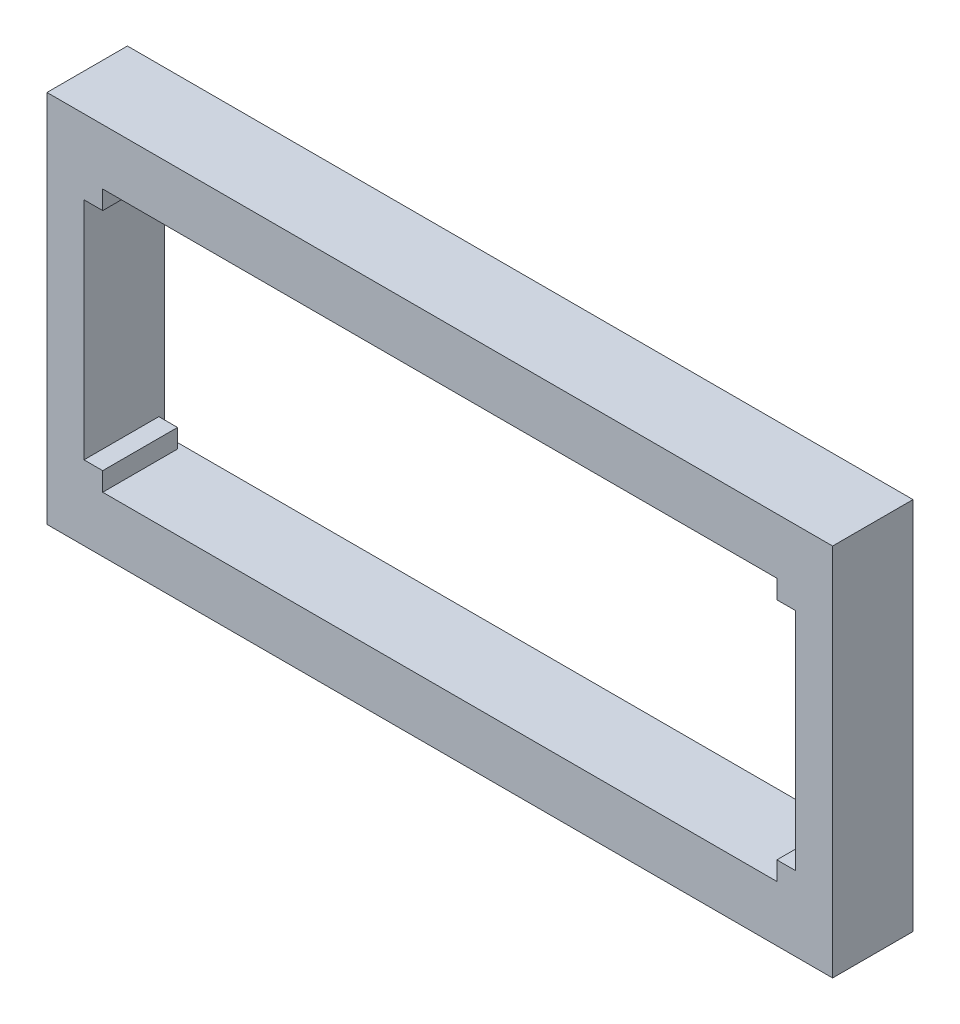
ISO-10303-21;
HEADER;
FILE_DESCRIPTION(('STEP AP214'),'2;1');
FILE_NAME('part.step','',(''),(''),'','','');
FILE_SCHEMA(('AUTOMOTIVE_DESIGN { 1 0 10303 214 1 1 1 1 }'));
ENDSEC;
DATA;
#1=APPLICATION_CONTEXT('core data for automotive mechanical design processes');
#2=APPLICATION_PROTOCOL_DEFINITION('international standard','automotive_design',2000,#1);
#3=PRODUCT_CONTEXT('',#1,'mechanical');
#4=PRODUCT('Part','Part','',(#3));
#5=PRODUCT_RELATED_PRODUCT_CATEGORY('part','',(#4));
#6=PRODUCT_DEFINITION_FORMATION('','',#4);
#7=PRODUCT_DEFINITION_CONTEXT('part definition',#1,'design');
#8=PRODUCT_DEFINITION('design','',#6,#7);
#9=PRODUCT_DEFINITION_SHAPE('','',#8);
#10=(LENGTH_UNIT() NAMED_UNIT(*) SI_UNIT(.MILLI.,.METRE.));
#11=(NAMED_UNIT(*) PLANE_ANGLE_UNIT() SI_UNIT($,.RADIAN.));
#12=(NAMED_UNIT(*) SI_UNIT($,.STERADIAN.) SOLID_ANGLE_UNIT());
#13=UNCERTAINTY_MEASURE_WITH_UNIT(LENGTH_MEASURE(1.E-05),#10,'distance_accuracy_value','');
#14=(GEOMETRIC_REPRESENTATION_CONTEXT(3) GLOBAL_UNCERTAINTY_ASSIGNED_CONTEXT((#13)) GLOBAL_UNIT_ASSIGNED_CONTEXT((#10,
#11,#12)) REPRESENTATION_CONTEXT('',''));
#15=CARTESIAN_POINT('',(0.,0.,0.));
#16=DIRECTION('',(0.,0.,1.));
#17=DIRECTION('',(1.,0.,0.));
#18=AXIS2_PLACEMENT_3D('',#15,#16,#17);
#19=CARTESIAN_POINT('',(0.,0.,0.));
#20=DIRECTION('',(0.,0.,1.));
#21=DIRECTION('',(1.,0.,0.));
#22=AXIS2_PLACEMENT_3D('',#19,#20,#21);
#23=PLANE('',#22);
#24=DIRECTION('',(0.,-1.,0.));
#25=VECTOR('',#24,1.);
#26=CARTESIAN_POINT('',(-9.90000000000001,85.1,0.));
#27=LINE('',#26,#25);
#28=CARTESIAN_POINT('',(-9.90000000000001,85.1,0.));
#29=VERTEX_POINT('',#28);
#30=CARTESIAN_POINT('',(-9.90000000000001,-14.9,0.));
#31=VERTEX_POINT('',#30);
#32=EDGE_CURVE('E414',#29,#31,#27,.T.);
#33=ORIENTED_EDGE('',*,*,#32,.F.);
#34=DIRECTION('',(-1.,0.,0.));
#35=VECTOR('',#34,1.);
#36=CARTESIAN_POINT('',(-9.90000000000001,85.1,0.));
#37=LINE('',#36,#35);
#38=CARTESIAN_POINT('',(200.1,85.1,0.));
#39=VERTEX_POINT('',#38);
#40=EDGE_CURVE('E281',#39,#29,#37,.T.);
#41=ORIENTED_EDGE('',*,*,#40,.F.);
#42=DIRECTION('',(0.,1.,0.));
#43=VECTOR('',#42,1.);
#44=CARTESIAN_POINT('',(200.1,85.1,0.));
#45=LINE('',#44,#43);
#46=CARTESIAN_POINT('',(200.1,-14.9,0.));
#47=VERTEX_POINT('',#46);
#48=EDGE_CURVE('E416',#47,#39,#45,.T.);
#49=ORIENTED_EDGE('',*,*,#48,.F.);
#50=DIRECTION('',(1.,0.,0.));
#51=VECTOR('',#50,1.);
#52=CARTESIAN_POINT('',(-9.90000000000001,-14.9,0.));
#53=LINE('',#52,#51);
#54=EDGE_CURVE('E420',#31,#47,#53,.T.);
#55=ORIENTED_EDGE('',*,*,#54,.F.);
#56=EDGE_LOOP('',(#33,#41,#49,#55));
#57=FACE_BOUND('',#56,.T.);
#58=DIRECTION('',(0.,-1.,0.));
#59=VECTOR('',#58,1.);
#60=CARTESIAN_POINT('',(0.,0.,0.));
#61=LINE('',#60,#59);
#62=CARTESIAN_POINT('',(0.,70.2,0.));
#63=VERTEX_POINT('',#62);
#64=CARTESIAN_POINT('',(0.,0.,0.));
#65=VERTEX_POINT('',#64);
#66=EDGE_CURVE('E158',#63,#65,#61,.T.);
#67=ORIENTED_EDGE('',*,*,#66,.T.);
#68=DIRECTION('',(1.,0.,0.));
#69=VECTOR('',#68,1.);
#70=CARTESIAN_POINT('',(0.,0.,0.));
#71=LINE('',#70,#69);
#72=CARTESIAN_POINT('',(190.2,0.,0.));
#73=VERTEX_POINT('',#72);
#74=EDGE_CURVE('E399',#65,#73,#71,.T.);
#75=ORIENTED_EDGE('',*,*,#74,.T.);
#76=DIRECTION('',(0.,1.,0.));
#77=VECTOR('',#76,1.);
#78=CARTESIAN_POINT('',(190.2,0.,0.));
#79=LINE('',#78,#77);
#80=CARTESIAN_POINT('',(190.2,70.2,0.));
#81=VERTEX_POINT('',#80);
#82=EDGE_CURVE('E405',#73,#81,#79,.T.);
#83=ORIENTED_EDGE('',*,*,#82,.T.);
#84=DIRECTION('',(-1.,0.,0.));
#85=VECTOR('',#84,1.);
#86=CARTESIAN_POINT('',(0.,70.2,0.));
#87=LINE('',#86,#85);
#88=EDGE_CURVE('E404',#81,#63,#87,.T.);
#89=ORIENTED_EDGE('',*,*,#88,.T.);
#90=EDGE_LOOP('',(#67,#75,#83,#89));
#91=FACE_BOUND('',#90,.T.);
#92=ADVANCED_FACE('F140',(#57,#91),#23,.F.);
#93=CARTESIAN_POINT('',(-9.90000000000001,85.1,1.5));
#94=DIRECTION('',(1.,0.,0.));
#95=DIRECTION('',(0.,0.,-1.));
#96=AXIS2_PLACEMENT_3D('',#93,#94,#95);
#97=PLANE('',#96);
#98=ORIENTED_EDGE('',*,*,#32,.T.);
#99=DIRECTION('',(0.,0.,-1.));
#100=VECTOR('',#99,1.);
#101=CARTESIAN_POINT('',(-9.90000000000001,-14.9,1.5));
#102=LINE('',#101,#100);
#103=CARTESIAN_POINT('',(-9.90000000000001,-14.9,21.5));
#104=VERTEX_POINT('',#103);
#105=EDGE_CURVE('E12',#104,#31,#102,.T.);
#106=ORIENTED_EDGE('',*,*,#105,.F.);
#107=DIRECTION('',(0.,-1.,0.));
#108=VECTOR('',#107,1.);
#109=CARTESIAN_POINT('',(-9.90000000000001,0.,21.5));
#110=LINE('',#109,#108);
#111=CARTESIAN_POINT('',(-9.90000000000001,85.1,21.5));
#112=VERTEX_POINT('',#111);
#113=EDGE_CURVE('E292',#112,#104,#110,.T.);
#114=ORIENTED_EDGE('',*,*,#113,.F.);
#115=DIRECTION('',(0.,0.,-1.));
#116=VECTOR('',#115,1.);
#117=CARTESIAN_POINT('',(-9.90000000000001,85.1,1.5));
#118=LINE('',#117,#116);
#119=EDGE_CURVE('E280',#112,#29,#118,.T.);
#120=ORIENTED_EDGE('',*,*,#119,.T.);
#121=EDGE_LOOP('',(#98,#106,#114,#120));
#122=FACE_BOUND('',#121,.T.);
#123=ADVANCED_FACE('F137',(#122),#97,.F.);
#124=CARTESIAN_POINT('',(-9.90000000000001,-14.9,1.5));
#125=DIRECTION('',(0.,1.,0.));
#126=DIRECTION('',(-1.,0.,0.));
#127=AXIS2_PLACEMENT_3D('',#124,#125,#126);
#128=PLANE('',#127);
#129=ORIENTED_EDGE('',*,*,#54,.T.);
#130=DIRECTION('',(0.,0.,-1.));
#131=VECTOR('',#130,1.);
#132=CARTESIAN_POINT('',(200.1,-14.9,1.5));
#133=LINE('',#132,#131);
#134=CARTESIAN_POINT('',(200.1,-14.9,21.5));
#135=VERTEX_POINT('',#134);
#136=EDGE_CURVE('E144',#135,#47,#133,.T.);
#137=ORIENTED_EDGE('',*,*,#136,.F.);
#138=DIRECTION('',(1.,0.,0.));
#139=VECTOR('',#138,1.);
#140=CARTESIAN_POINT('',(0.,-14.9,21.5));
#141=LINE('',#140,#139);
#142=EDGE_CURVE('E293',#104,#135,#141,.T.);
#143=ORIENTED_EDGE('',*,*,#142,.F.);
#144=ORIENTED_EDGE('',*,*,#105,.T.);
#145=EDGE_LOOP('',(#129,#137,#143,#144));
#146=FACE_BOUND('',#145,.T.);
#147=ADVANCED_FACE('F429',(#146),#128,.F.);
#148=CARTESIAN_POINT('',(200.1,85.1,1.5));
#149=DIRECTION('',(-1.,0.,0.));
#150=DIRECTION('',(0.,0.,1.));
#151=AXIS2_PLACEMENT_3D('',#148,#149,#150);
#152=PLANE('',#151);
#153=ORIENTED_EDGE('',*,*,#48,.T.);
#154=DIRECTION('',(0.,0.,-1.));
#155=VECTOR('',#154,1.);
#156=CARTESIAN_POINT('',(200.1,85.1,1.5));
#157=LINE('',#156,#155);
#158=CARTESIAN_POINT('',(200.1,85.1,21.5));
#159=VERTEX_POINT('',#158);
#160=EDGE_CURVE('E288',#159,#39,#157,.T.);
#161=ORIENTED_EDGE('',*,*,#160,.F.);
#162=DIRECTION('',(0.,1.,0.));
#163=VECTOR('',#162,1.);
#164=CARTESIAN_POINT('',(200.1,0.,21.5));
#165=LINE('',#164,#163);
#166=EDGE_CURVE('E296',#135,#159,#165,.T.);
#167=ORIENTED_EDGE('',*,*,#166,.F.);
#168=ORIENTED_EDGE('',*,*,#136,.T.);
#169=EDGE_LOOP('',(#153,#161,#167,#168));
#170=FACE_BOUND('',#169,.T.);
#171=ADVANCED_FACE('F421',(#170),#152,.F.);
#172=CARTESIAN_POINT('',(-9.90000000000001,85.1,1.5));
#173=DIRECTION('',(0.,-1.,0.));
#174=DIRECTION('',(1.,0.,0.));
#175=AXIS2_PLACEMENT_3D('',#172,#173,#174);
#176=PLANE('',#175);
#177=ORIENTED_EDGE('',*,*,#40,.T.);
#178=ORIENTED_EDGE('',*,*,#119,.F.);
#179=DIRECTION('',(-1.,0.,0.));
#180=VECTOR('',#179,1.);
#181=CARTESIAN_POINT('',(0.,85.1,21.5));
#182=LINE('',#181,#180);
#183=EDGE_CURVE('E285',#159,#112,#182,.T.);
#184=ORIENTED_EDGE('',*,*,#183,.F.);
#185=ORIENTED_EDGE('',*,*,#160,.T.);
#186=EDGE_LOOP('',(#177,#178,#184,#185));
#187=FACE_BOUND('',#186,.T.);
#188=ADVANCED_FACE('F278',(#187),#176,.F.);
#189=CARTESIAN_POINT('',(0.,0.,1.5));
#190=DIRECTION('',(1.,0.,0.));
#191=DIRECTION('',(0.,0.,-1.));
#192=AXIS2_PLACEMENT_3D('',#189,#190,#191);
#193=PLANE('',#192);
#194=ORIENTED_EDGE('',*,*,#66,.F.);
#195=DIRECTION('',(0.,0.,-1.));
#196=VECTOR('',#195,1.);
#197=CARTESIAN_POINT('',(0.,70.2,1.5));
#198=LINE('',#197,#196);
#199=CARTESIAN_POINT('',(0.,70.2,1.5));
#200=VERTEX_POINT('',#199);
#201=EDGE_CURVE('E400',#200,#63,#198,.T.);
#202=ORIENTED_EDGE('',*,*,#201,.F.);
#203=DIRECTION('',(0.,-1.,0.));
#204=VECTOR('',#203,1.);
#205=CARTESIAN_POINT('',(0.,0.,1.5));
#206=LINE('',#205,#204);
#207=CARTESIAN_POINT('',(0.,65.2,1.5));
#208=VERTEX_POINT('',#207);
#209=EDGE_CURVE('E381',#200,#208,#206,.T.);
#210=ORIENTED_EDGE('',*,*,#209,.T.);
#211=DIRECTION('',(0.,0.,-1.));
#212=VECTOR('',#211,1.);
#213=CARTESIAN_POINT('',(0.,65.2,21.5));
#214=LINE('',#213,#212);
#215=CARTESIAN_POINT('',(0.,65.2,21.5));
#216=VERTEX_POINT('',#215);
#217=EDGE_CURVE('E316',#216,#208,#214,.T.);
#218=ORIENTED_EDGE('',*,*,#217,.F.);
#219=DIRECTION('',(0.,1.,0.));
#220=VECTOR('',#219,1.);
#221=CARTESIAN_POINT('',(0.,0.,21.5));
#222=LINE('',#221,#220);
#223=CARTESIAN_POINT('',(0.,5.00000000000001,21.5));
#224=VERTEX_POINT('',#223);
#225=EDGE_CURVE('E305',#224,#216,#222,.T.);
#226=ORIENTED_EDGE('',*,*,#225,.F.);
#227=DIRECTION('',(0.,0.,-1.));
#228=VECTOR('',#227,1.);
#229=CARTESIAN_POINT('',(0.,5.00000000000001,21.5));
#230=LINE('',#229,#228);
#231=CARTESIAN_POINT('',(0.,5.00000000000001,1.5));
#232=VERTEX_POINT('',#231);
#233=EDGE_CURVE('E314',#224,#232,#230,.T.);
#234=ORIENTED_EDGE('',*,*,#233,.T.);
#235=CARTESIAN_POINT('',(0.,0.,1.5));
#236=VERTEX_POINT('',#235);
#237=EDGE_CURVE('E390',#232,#236,#206,.T.);
#238=ORIENTED_EDGE('',*,*,#237,.T.);
#239=DIRECTION('',(0.,0.,-1.));
#240=VECTOR('',#239,1.);
#241=CARTESIAN_POINT('',(0.,0.,1.5));
#242=LINE('',#241,#240);
#243=EDGE_CURVE('E412',#236,#65,#242,.T.);
#244=ORIENTED_EDGE('',*,*,#243,.T.);
#245=EDGE_LOOP('',(#194,#202,#210,#218,#226,#234,#238,#244));
#246=FACE_BOUND('',#245,.T.);
#247=ADVANCED_FACE('F445',(#246),#193,.T.);
#248=CARTESIAN_POINT('',(0.,0.,1.5));
#249=DIRECTION('',(0.,1.,0.));
#250=DIRECTION('',(0.,0.,1.));
#251=AXIS2_PLACEMENT_3D('',#248,#249,#250);
#252=PLANE('',#251);
#253=ORIENTED_EDGE('',*,*,#74,.F.);
#254=ORIENTED_EDGE('',*,*,#243,.F.);
#255=DIRECTION('',(1.,0.,0.));
#256=VECTOR('',#255,1.);
#257=CARTESIAN_POINT('',(0.,0.,1.5));
#258=LINE('',#257,#256);
#259=CARTESIAN_POINT('',(5.00000000000005,0.,1.5));
#260=VERTEX_POINT('',#259);
#261=EDGE_CURVE('E388',#236,#260,#258,.T.);
#262=ORIENTED_EDGE('',*,*,#261,.T.);
#263=DIRECTION('',(0.,0.,-1.));
#264=VECTOR('',#263,1.);
#265=CARTESIAN_POINT('',(5.00000000000005,0.,21.5));
#266=LINE('',#265,#264);
#267=CARTESIAN_POINT('',(5.00000000000005,0.,21.5));
#268=VERTEX_POINT('',#267);
#269=EDGE_CURVE('E321',#268,#260,#266,.T.);
#270=ORIENTED_EDGE('',*,*,#269,.F.);
#271=DIRECTION('',(-1.,0.,0.));
#272=VECTOR('',#271,1.);
#273=CARTESIAN_POINT('',(0.,0.,21.5));
#274=LINE('',#273,#272);
#275=CARTESIAN_POINT('',(185.2,0.,21.5));
#276=VERTEX_POINT('',#275);
#277=EDGE_CURVE('E513',#276,#268,#274,.T.);
#278=ORIENTED_EDGE('',*,*,#277,.F.);
#279=DIRECTION('',(0.,0.,-1.));
#280=VECTOR('',#279,1.);
#281=CARTESIAN_POINT('',(185.2,0.,21.5));
#282=LINE('',#281,#280);
#283=CARTESIAN_POINT('',(185.2,0.,1.5));
#284=VERTEX_POINT('',#283);
#285=EDGE_CURVE('E318',#276,#284,#282,.T.);
#286=ORIENTED_EDGE('',*,*,#285,.T.);
#287=CARTESIAN_POINT('',(190.2,0.,1.5));
#288=VERTEX_POINT('',#287);
#289=EDGE_CURVE('E387',#284,#288,#258,.T.);
#290=ORIENTED_EDGE('',*,*,#289,.T.);
#291=DIRECTION('',(0.,0.,-1.));
#292=VECTOR('',#291,1.);
#293=CARTESIAN_POINT('',(190.2,0.,1.5));
#294=LINE('',#293,#292);
#295=EDGE_CURVE('E411',#288,#73,#294,.T.);
#296=ORIENTED_EDGE('',*,*,#295,.T.);
#297=EDGE_LOOP('',(#253,#254,#262,#270,#278,#286,#290,#296));
#298=FACE_BOUND('',#297,.T.);
#299=ADVANCED_FACE('F448',(#298),#252,.T.);
#300=CARTESIAN_POINT('',(190.2,0.,1.5));
#301=DIRECTION('',(-1.,0.,0.));
#302=DIRECTION('',(0.,0.,1.));
#303=AXIS2_PLACEMENT_3D('',#300,#301,#302);
#304=PLANE('',#303);
#305=ORIENTED_EDGE('',*,*,#82,.F.);
#306=ORIENTED_EDGE('',*,*,#295,.F.);
#307=DIRECTION('',(0.,1.,0.));
#308=VECTOR('',#307,1.);
#309=CARTESIAN_POINT('',(190.2,0.,1.5));
#310=LINE('',#309,#308);
#311=CARTESIAN_POINT('',(190.2,5.00000000000003,1.5));
#312=VERTEX_POINT('',#311);
#313=EDGE_CURVE('E392',#288,#312,#310,.T.);
#314=ORIENTED_EDGE('',*,*,#313,.T.);
#315=DIRECTION('',(0.,0.,-1.));
#316=VECTOR('',#315,1.);
#317=CARTESIAN_POINT('',(190.2,5.00000000000003,21.5));
#318=LINE('',#317,#316);
#319=CARTESIAN_POINT('',(190.2,5.00000000000003,21.5));
#320=VERTEX_POINT('',#319);
#321=EDGE_CURVE('E322',#320,#312,#318,.T.);
#322=ORIENTED_EDGE('',*,*,#321,.F.);
#323=DIRECTION('',(0.,-1.,0.));
#324=VECTOR('',#323,1.);
#325=CARTESIAN_POINT('',(190.2,0.,21.5));
#326=LINE('',#325,#324);
#327=CARTESIAN_POINT('',(190.2,65.2,21.5));
#328=VERTEX_POINT('',#327);
#329=EDGE_CURVE('E345',#328,#320,#326,.T.);
#330=ORIENTED_EDGE('',*,*,#329,.F.);
#331=DIRECTION('',(0.,0.,-1.));
#332=VECTOR('',#331,1.);
#333=CARTESIAN_POINT('',(190.2,65.2,21.5));
#334=LINE('',#333,#332);
#335=CARTESIAN_POINT('',(190.2,65.2,1.5));
#336=VERTEX_POINT('',#335);
#337=EDGE_CURVE('E324',#328,#336,#334,.T.);
#338=ORIENTED_EDGE('',*,*,#337,.T.);
#339=CARTESIAN_POINT('',(190.2,70.2,1.5));
#340=VERTEX_POINT('',#339);
#341=EDGE_CURVE('E393',#336,#340,#310,.T.);
#342=ORIENTED_EDGE('',*,*,#341,.T.);
#343=DIRECTION('',(0.,0.,-1.));
#344=VECTOR('',#343,1.);
#345=CARTESIAN_POINT('',(190.2,70.2,1.5));
#346=LINE('',#345,#344);
#347=EDGE_CURVE('E407',#340,#81,#346,.T.);
#348=ORIENTED_EDGE('',*,*,#347,.T.);
#349=EDGE_LOOP('',(#305,#306,#314,#322,#330,#338,#342,#348));
#350=FACE_BOUND('',#349,.T.);
#351=ADVANCED_FACE('F455',(#350),#304,.T.);
#352=CARTESIAN_POINT('',(0.,70.2,1.5));
#353=DIRECTION('',(0.,-1.,0.));
#354=DIRECTION('',(0.,0.,-1.));
#355=AXIS2_PLACEMENT_3D('',#352,#353,#354);
#356=PLANE('',#355);
#357=ORIENTED_EDGE('',*,*,#88,.F.);
#358=ORIENTED_EDGE('',*,*,#347,.F.);
#359=DIRECTION('',(-1.,0.,0.));
#360=VECTOR('',#359,1.);
#361=CARTESIAN_POINT('',(0.,70.2,1.5));
#362=LINE('',#361,#360);
#363=CARTESIAN_POINT('',(185.2,70.2,1.5));
#364=VERTEX_POINT('',#363);
#365=EDGE_CURVE('E155',#340,#364,#362,.T.);
#366=ORIENTED_EDGE('',*,*,#365,.T.);
#367=DIRECTION('',(0.,0.,-1.));
#368=VECTOR('',#367,1.);
#369=CARTESIAN_POINT('',(185.2,70.2,21.5));
#370=LINE('',#369,#368);
#371=CARTESIAN_POINT('',(185.2,70.2,21.5));
#372=VERTEX_POINT('',#371);
#373=EDGE_CURVE('E307',#372,#364,#370,.T.);
#374=ORIENTED_EDGE('',*,*,#373,.F.);
#375=DIRECTION('',(1.,0.,0.));
#376=VECTOR('',#375,1.);
#377=CARTESIAN_POINT('',(0.,70.2,21.5));
#378=LINE('',#377,#376);
#379=CARTESIAN_POINT('',(5.00000000000004,70.2,21.5));
#380=VERTEX_POINT('',#379);
#381=EDGE_CURVE('E303',#380,#372,#378,.T.);
#382=ORIENTED_EDGE('',*,*,#381,.F.);
#383=DIRECTION('',(0.,0.,-1.));
#384=VECTOR('',#383,1.);
#385=CARTESIAN_POINT('',(5.00000000000004,70.2,21.5));
#386=LINE('',#385,#384);
#387=CARTESIAN_POINT('',(5.00000000000004,70.2,1.5));
#388=VERTEX_POINT('',#387);
#389=EDGE_CURVE('E315',#380,#388,#386,.T.);
#390=ORIENTED_EDGE('',*,*,#389,.T.);
#391=EDGE_CURVE('E394',#388,#200,#362,.T.);
#392=ORIENTED_EDGE('',*,*,#391,.T.);
#393=ORIENTED_EDGE('',*,*,#201,.T.);
#394=EDGE_LOOP('',(#357,#358,#366,#374,#382,#390,#392,#393));
#395=FACE_BOUND('',#394,.T.);
#396=ADVANCED_FACE('F460',(#395),#356,.T.);
#397=CARTESIAN_POINT('',(0.,0.,1.5));
#398=DIRECTION('',(0.,0.,1.));
#399=DIRECTION('',(1.,0.,0.));
#400=AXIS2_PLACEMENT_3D('',#397,#398,#399);
#401=PLANE('',#400);
#402=ORIENTED_EDGE('',*,*,#261,.F.);
#403=ORIENTED_EDGE('',*,*,#237,.F.);
#404=DIRECTION('',(1.,0.,0.));
#405=VECTOR('',#404,1.);
#406=CARTESIAN_POINT('',(0.,5.00000000000001,1.5));
#407=LINE('',#406,#405);
#408=CARTESIAN_POINT('',(5.00000000000005,5.00000000000001,1.5));
#409=VERTEX_POINT('',#408);
#410=EDGE_CURVE('E348',#232,#409,#407,.T.);
#411=ORIENTED_EDGE('',*,*,#410,.T.);
#412=DIRECTION('',(0.,1.,0.));
#413=VECTOR('',#412,1.);
#414=CARTESIAN_POINT('',(5.00000000000005,0.,1.5));
#415=LINE('',#414,#413);
#416=EDGE_CURVE('E350',#260,#409,#415,.T.);
#417=ORIENTED_EDGE('',*,*,#416,.F.);
#418=EDGE_LOOP('',(#402,#403,#411,#417));
#419=FACE_BOUND('',#418,.T.);
#420=ADVANCED_FACE('F464',(#419),#401,.F.);
#421=ORIENTED_EDGE('',*,*,#209,.F.);
#422=ORIENTED_EDGE('',*,*,#391,.F.);
#423=DIRECTION('',(0.,-1.,0.));
#424=VECTOR('',#423,1.);
#425=CARTESIAN_POINT('',(5.00000000000004,70.2,1.5));
#426=LINE('',#425,#424);
#427=CARTESIAN_POINT('',(5.00000000000004,65.2,1.5));
#428=VERTEX_POINT('',#427);
#429=EDGE_CURVE('E331',#388,#428,#426,.T.);
#430=ORIENTED_EDGE('',*,*,#429,.T.);
#431=DIRECTION('',(1.,0.,0.));
#432=VECTOR('',#431,1.);
#433=CARTESIAN_POINT('',(0.,65.2,1.5));
#434=LINE('',#433,#432);
#435=EDGE_CURVE('E335',#208,#428,#434,.T.);
#436=ORIENTED_EDGE('',*,*,#435,.F.);
#437=EDGE_LOOP('',(#421,#422,#430,#436));
#438=FACE_BOUND('',#437,.T.);
#439=ADVANCED_FACE('F544',(#438),#401,.F.);
#440=ORIENTED_EDGE('',*,*,#289,.F.);
#441=DIRECTION('',(0.,1.,0.));
#442=VECTOR('',#441,1.);
#443=CARTESIAN_POINT('',(185.2,0.,1.5));
#444=LINE('',#443,#442);
#445=CARTESIAN_POINT('',(185.2,5.00000000000003,1.5));
#446=VERTEX_POINT('',#445);
#447=EDGE_CURVE('E380',#284,#446,#444,.T.);
#448=ORIENTED_EDGE('',*,*,#447,.T.);
#449=DIRECTION('',(-1.,0.,0.));
#450=VECTOR('',#449,1.);
#451=CARTESIAN_POINT('',(190.2,5.00000000000003,1.5));
#452=LINE('',#451,#450);
#453=EDGE_CURVE('E373',#312,#446,#452,.T.);
#454=ORIENTED_EDGE('',*,*,#453,.F.);
#455=ORIENTED_EDGE('',*,*,#313,.F.);
#456=EDGE_LOOP('',(#440,#448,#454,#455));
#457=FACE_BOUND('',#456,.T.);
#458=ADVANCED_FACE('F473',(#457),#401,.F.);
#459=ORIENTED_EDGE('',*,*,#365,.F.);
#460=ORIENTED_EDGE('',*,*,#341,.F.);
#461=DIRECTION('',(-1.,0.,0.));
#462=VECTOR('',#461,1.);
#463=CARTESIAN_POINT('',(190.2,65.2,1.5));
#464=LINE('',#463,#462);
#465=CARTESIAN_POINT('',(185.2,65.2,1.5));
#466=VERTEX_POINT('',#465);
#467=EDGE_CURVE('E362',#336,#466,#464,.T.);
#468=ORIENTED_EDGE('',*,*,#467,.T.);
#469=DIRECTION('',(0.,-1.,0.));
#470=VECTOR('',#469,1.);
#471=CARTESIAN_POINT('',(185.2,70.2,1.5));
#472=LINE('',#471,#470);
#473=EDGE_CURVE('E365',#364,#466,#472,.T.);
#474=ORIENTED_EDGE('',*,*,#473,.F.);
#475=EDGE_LOOP('',(#459,#460,#468,#474));
#476=FACE_BOUND('',#475,.T.);
#477=ADVANCED_FACE('F472',(#476),#401,.F.);
#478=CARTESIAN_POINT('',(0.,0.,21.5));
#479=DIRECTION('',(0.,0.,1.));
#480=DIRECTION('',(1.,0.,0.));
#481=AXIS2_PLACEMENT_3D('',#478,#479,#480);
#482=PLANE('',#481);
#483=DIRECTION('',(-1.,0.,0.));
#484=VECTOR('',#483,1.);
#485=CARTESIAN_POINT('',(190.2,65.2,21.5));
#486=LINE('',#485,#484);
#487=CARTESIAN_POINT('',(185.2,65.2,21.5));
#488=VERTEX_POINT('',#487);
#489=EDGE_CURVE('E358',#328,#488,#486,.T.);
#490=ORIENTED_EDGE('',*,*,#489,.F.);
#491=ORIENTED_EDGE('',*,*,#329,.T.);
#492=DIRECTION('',(-1.,0.,0.));
#493=VECTOR('',#492,1.);
#494=CARTESIAN_POINT('',(190.2,5.00000000000003,21.5));
#495=LINE('',#494,#493);
#496=CARTESIAN_POINT('',(185.2,5.00000000000003,21.5));
#497=VERTEX_POINT('',#496);
#498=EDGE_CURVE('E371',#320,#497,#495,.T.);
#499=ORIENTED_EDGE('',*,*,#498,.T.);
#500=DIRECTION('',(0.,1.,0.));
#501=VECTOR('',#500,1.);
#502=CARTESIAN_POINT('',(185.2,0.,21.5));
#503=LINE('',#502,#501);
#504=EDGE_CURVE('E372',#276,#497,#503,.T.);
#505=ORIENTED_EDGE('',*,*,#504,.F.);
#506=ORIENTED_EDGE('',*,*,#277,.T.);
#507=DIRECTION('',(0.,1.,0.));
#508=VECTOR('',#507,1.);
#509=CARTESIAN_POINT('',(5.00000000000005,0.,21.5));
#510=LINE('',#509,#508);
#511=CARTESIAN_POINT('',(5.00000000000005,5.00000000000001,21.5));
#512=VERTEX_POINT('',#511);
#513=EDGE_CURVE('E343',#268,#512,#510,.T.);
#514=ORIENTED_EDGE('',*,*,#513,.T.);
#515=DIRECTION('',(1.,0.,0.));
#516=VECTOR('',#515,1.);
#517=CARTESIAN_POINT('',(0.,5.00000000000001,21.5));
#518=LINE('',#517,#516);
#519=EDGE_CURVE('E341',#224,#512,#518,.T.);
#520=ORIENTED_EDGE('',*,*,#519,.F.);
#521=ORIENTED_EDGE('',*,*,#225,.T.);
#522=DIRECTION('',(1.,0.,0.));
#523=VECTOR('',#522,1.);
#524=CARTESIAN_POINT('',(0.,65.2,21.5));
#525=LINE('',#524,#523);
#526=CARTESIAN_POINT('',(5.00000000000004,65.2,21.5));
#527=VERTEX_POINT('',#526);
#528=EDGE_CURVE('E332',#216,#527,#525,.T.);
#529=ORIENTED_EDGE('',*,*,#528,.T.);
#530=DIRECTION('',(0.,-1.,0.));
#531=VECTOR('',#530,1.);
#532=CARTESIAN_POINT('',(5.00000000000004,70.2,21.5));
#533=LINE('',#532,#531);
#534=EDGE_CURVE('E329',#380,#527,#533,.T.);
#535=ORIENTED_EDGE('',*,*,#534,.F.);
#536=ORIENTED_EDGE('',*,*,#381,.T.);
#537=DIRECTION('',(0.,-1.,0.));
#538=VECTOR('',#537,1.);
#539=CARTESIAN_POINT('',(185.2,70.2,21.5));
#540=LINE('',#539,#538);
#541=EDGE_CURVE('E361',#372,#488,#540,.T.);
#542=ORIENTED_EDGE('',*,*,#541,.T.);
#543=EDGE_LOOP('',(#490,#491,#499,#505,#506,#514,#520,#521,#529,#535,#536,#542));
#544=FACE_BOUND('',#543,.T.);
#545=ORIENTED_EDGE('',*,*,#183,.T.);
#546=ORIENTED_EDGE('',*,*,#113,.T.);
#547=ORIENTED_EDGE('',*,*,#142,.T.);
#548=ORIENTED_EDGE('',*,*,#166,.T.);
#549=EDGE_LOOP('',(#545,#546,#547,#548));
#550=FACE_BOUND('',#549,.T.);
#551=ADVANCED_FACE('F298',(#544,#550),#482,.T.);
#552=CARTESIAN_POINT('',(190.2,5.00000000000003,21.5));
#553=DIRECTION('',(0.,-1.,0.));
#554=DIRECTION('',(0.,0.,-1.));
#555=AXIS2_PLACEMENT_3D('',#552,#553,#554);
#556=PLANE('',#555);
#557=ORIENTED_EDGE('',*,*,#453,.T.);
#558=DIRECTION('',(0.,0.,-1.));
#559=VECTOR('',#558,1.);
#560=CARTESIAN_POINT('',(185.2,5.00000000000003,21.5));
#561=LINE('',#560,#559);
#562=EDGE_CURVE('E370',#497,#446,#561,.T.);
#563=ORIENTED_EDGE('',*,*,#562,.F.);
#564=ORIENTED_EDGE('',*,*,#498,.F.);
#565=ORIENTED_EDGE('',*,*,#321,.T.);
#566=EDGE_LOOP('',(#557,#563,#564,#565));
#567=FACE_BOUND('',#566,.T.);
#568=ADVANCED_FACE('F469',(#567),#556,.F.);
#569=CARTESIAN_POINT('',(185.2,0.,21.5));
#570=DIRECTION('',(-1.,0.,0.));
#571=DIRECTION('',(0.,0.,1.));
#572=AXIS2_PLACEMENT_3D('',#569,#570,#571);
#573=PLANE('',#572);
#574=ORIENTED_EDGE('',*,*,#447,.F.);
#575=ORIENTED_EDGE('',*,*,#285,.F.);
#576=ORIENTED_EDGE('',*,*,#504,.T.);
#577=ORIENTED_EDGE('',*,*,#562,.T.);
#578=EDGE_LOOP('',(#574,#575,#576,#577));
#579=FACE_BOUND('',#578,.T.);
#580=ADVANCED_FACE('F463',(#579),#573,.T.);
#581=CARTESIAN_POINT('',(185.2,70.2,21.5));
#582=DIRECTION('',(1.,0.,0.));
#583=DIRECTION('',(0.,0.,-1.));
#584=AXIS2_PLACEMENT_3D('',#581,#582,#583);
#585=PLANE('',#584);
#586=ORIENTED_EDGE('',*,*,#473,.T.);
#587=DIRECTION('',(0.,0.,-1.));
#588=VECTOR('',#587,1.);
#589=CARTESIAN_POINT('',(185.2,65.2,21.5));
#590=LINE('',#589,#588);
#591=EDGE_CURVE('E355',#488,#466,#590,.T.);
#592=ORIENTED_EDGE('',*,*,#591,.F.);
#593=ORIENTED_EDGE('',*,*,#541,.F.);
#594=ORIENTED_EDGE('',*,*,#373,.T.);
#595=EDGE_LOOP('',(#586,#592,#593,#594));
#596=FACE_BOUND('',#595,.T.);
#597=ADVANCED_FACE('F468',(#596),#585,.F.);
#598=CARTESIAN_POINT('',(190.2,65.2,21.5));
#599=DIRECTION('',(0.,-1.,0.));
#600=DIRECTION('',(0.,0.,-1.));
#601=AXIS2_PLACEMENT_3D('',#598,#599,#600);
#602=PLANE('',#601);
#603=ORIENTED_EDGE('',*,*,#467,.F.);
#604=ORIENTED_EDGE('',*,*,#337,.F.);
#605=ORIENTED_EDGE('',*,*,#489,.T.);
#606=ORIENTED_EDGE('',*,*,#591,.T.);
#607=EDGE_LOOP('',(#603,#604,#605,#606));
#608=FACE_BOUND('',#607,.T.);
#609=ADVANCED_FACE('F477',(#608),#602,.T.);
#610=CARTESIAN_POINT('',(5.00000000000005,0.,21.5));
#611=DIRECTION('',(-1.,0.,0.));
#612=DIRECTION('',(0.,-1.,0.));
#613=AXIS2_PLACEMENT_3D('',#610,#611,#612);
#614=PLANE('',#613);
#615=ORIENTED_EDGE('',*,*,#416,.T.);
#616=DIRECTION('',(0.,0.,-1.));
#617=VECTOR('',#616,1.);
#618=CARTESIAN_POINT('',(5.00000000000005,5.00000000000001,21.5));
#619=LINE('',#618,#617);
#620=EDGE_CURVE('E336',#512,#409,#619,.T.);
#621=ORIENTED_EDGE('',*,*,#620,.F.);
#622=ORIENTED_EDGE('',*,*,#513,.F.);
#623=ORIENTED_EDGE('',*,*,#269,.T.);
#624=EDGE_LOOP('',(#615,#621,#622,#623));
#625=FACE_BOUND('',#624,.T.);
#626=ADVANCED_FACE('F479',(#625),#614,.F.);
#627=CARTESIAN_POINT('',(0.,5.00000000000001,21.5));
#628=DIRECTION('',(0.,1.,0.));
#629=DIRECTION('',(0.,0.,1.));
#630=AXIS2_PLACEMENT_3D('',#627,#628,#629);
#631=PLANE('',#630);
#632=ORIENTED_EDGE('',*,*,#410,.F.);
#633=ORIENTED_EDGE('',*,*,#233,.F.);
#634=ORIENTED_EDGE('',*,*,#519,.T.);
#635=ORIENTED_EDGE('',*,*,#620,.T.);
#636=EDGE_LOOP('',(#632,#633,#634,#635));
#637=FACE_BOUND('',#636,.T.);
#638=ADVANCED_FACE('F488',(#637),#631,.T.);
#639=CARTESIAN_POINT('',(0.,65.2,21.5));
#640=DIRECTION('',(0.,1.,0.));
#641=DIRECTION('',(0.,0.,1.));
#642=AXIS2_PLACEMENT_3D('',#639,#640,#641);
#643=PLANE('',#642);
#644=ORIENTED_EDGE('',*,*,#435,.T.);
#645=DIRECTION('',(0.,0.,-1.));
#646=VECTOR('',#645,1.);
#647=CARTESIAN_POINT('',(5.00000000000004,65.2,21.5));
#648=LINE('',#647,#646);
#649=EDGE_CURVE('E334',#527,#428,#648,.T.);
#650=ORIENTED_EDGE('',*,*,#649,.F.);
#651=ORIENTED_EDGE('',*,*,#528,.F.);
#652=ORIENTED_EDGE('',*,*,#217,.T.);
#653=EDGE_LOOP('',(#644,#650,#651,#652));
#654=FACE_BOUND('',#653,.T.);
#655=ADVANCED_FACE('F487',(#654),#643,.F.);
#656=CARTESIAN_POINT('',(5.00000000000004,70.2,21.5));
#657=DIRECTION('',(1.,0.,0.));
#658=DIRECTION('',(0.,0.,-1.));
#659=AXIS2_PLACEMENT_3D('',#656,#657,#658);
#660=PLANE('',#659);
#661=ORIENTED_EDGE('',*,*,#429,.F.);
#662=ORIENTED_EDGE('',*,*,#389,.F.);
#663=ORIENTED_EDGE('',*,*,#534,.T.);
#664=ORIENTED_EDGE('',*,*,#649,.T.);
#665=EDGE_LOOP('',(#661,#662,#663,#664));
#666=FACE_BOUND('',#665,.T.);
#667=ADVANCED_FACE('F495',(#666),#660,.T.);
#668=CLOSED_SHELL('',(#92,#123,#147,#171,#188,#247,#299,#351,#396,#420,#439,#458,#477,#551,#568,
#580,#597,#609,#626,#638,#655,#667));
#669=MANIFOLD_SOLID_BREP('B2',#668);
#670=ADVANCED_BREP_SHAPE_REPRESENTATION('',(#18,#669),#14);
#671=SHAPE_DEFINITION_REPRESENTATION(#9,#670);
ENDSEC;
END-ISO-10303-21;
